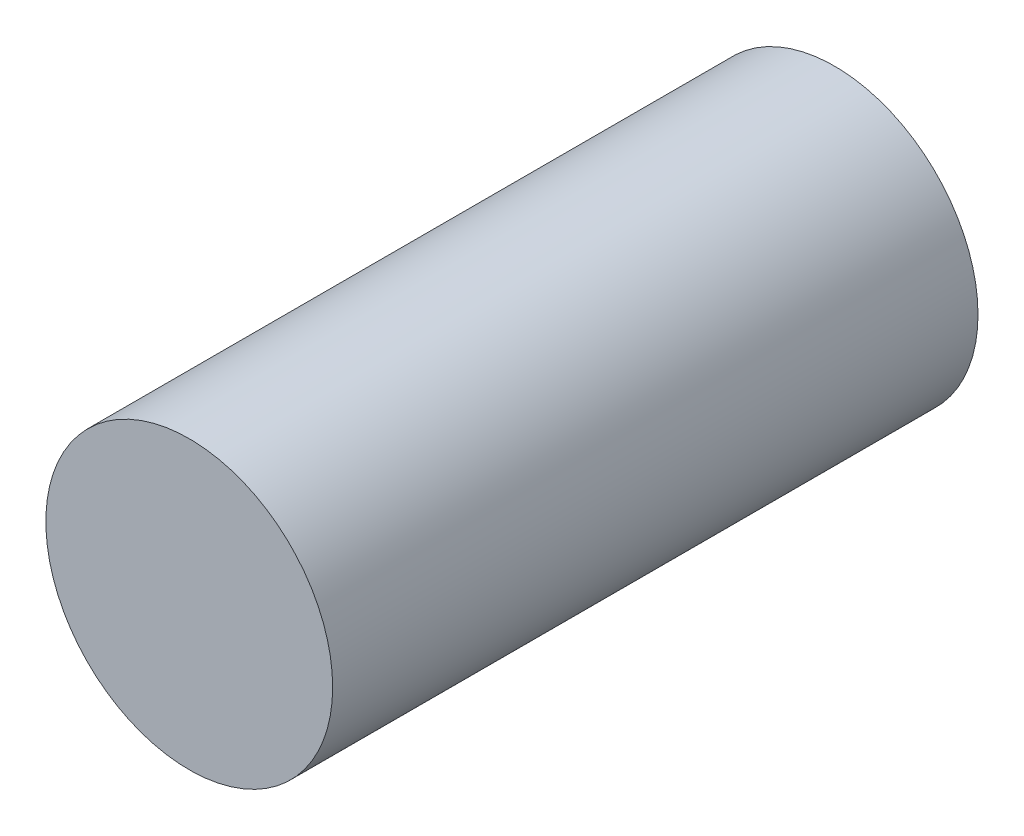
ISO-10303-21;
HEADER;
FILE_DESCRIPTION(('STEP AP214'),'2;1');
FILE_NAME('part.step','',(''),(''),'','','');
FILE_SCHEMA(('AUTOMOTIVE_DESIGN { 1 0 10303 214 1 1 1 1 }'));
ENDSEC;
DATA;
#1=APPLICATION_CONTEXT('core data for automotive mechanical design processes');
#2=APPLICATION_PROTOCOL_DEFINITION('international standard','automotive_design',2000,#1);
#3=PRODUCT_CONTEXT('',#1,'mechanical');
#4=PRODUCT('Part','Part','',(#3));
#5=PRODUCT_RELATED_PRODUCT_CATEGORY('part','',(#4));
#6=PRODUCT_DEFINITION_FORMATION('','',#4);
#7=PRODUCT_DEFINITION_CONTEXT('part definition',#1,'design');
#8=PRODUCT_DEFINITION('design','',#6,#7);
#9=PRODUCT_DEFINITION_SHAPE('','',#8);
#10=(LENGTH_UNIT() NAMED_UNIT(*) SI_UNIT(.MILLI.,.METRE.));
#11=(NAMED_UNIT(*) PLANE_ANGLE_UNIT() SI_UNIT($,.RADIAN.));
#12=(NAMED_UNIT(*) SI_UNIT($,.STERADIAN.) SOLID_ANGLE_UNIT());
#13=UNCERTAINTY_MEASURE_WITH_UNIT(LENGTH_MEASURE(1.E-05),#10,'distance_accuracy_value','');
#14=(GEOMETRIC_REPRESENTATION_CONTEXT(3) GLOBAL_UNCERTAINTY_ASSIGNED_CONTEXT((#13)) GLOBAL_UNIT_ASSIGNED_CONTEXT((#10,
#11,#12)) REPRESENTATION_CONTEXT('',''));
#15=CARTESIAN_POINT('',(0.,0.,0.));
#16=DIRECTION('',(0.,0.,1.));
#17=DIRECTION('',(1.,0.,0.));
#18=AXIS2_PLACEMENT_3D('',#15,#16,#17);
#19=CARTESIAN_POINT('',(21.5943396226415,0.,-90.));
#20=DIRECTION('',(0.,0.,-1.));
#21=DIRECTION('',(-0.999771447850948,0.0213787759710261,0.));
#22=AXIS2_PLACEMENT_3D('',#19,#20,#21);
#23=PLANE('',#22);
#24=CARTESIAN_POINT('',(21.5943396226415,0.,-90.));
#25=DIRECTION('',(0.,0.,-1.));
#26=DIRECTION('',(-1.,0.,0.));
#27=AXIS2_PLACEMENT_3D('',#24,#25,#26);
#28=CIRCLE('',#27,20.);
#29=CARTESIAN_POINT('',(1.59433962264151,0.,-90.));
#30=VERTEX_POINT('',#29);
#31=EDGE_CURVE('E10',#30,#30,#28,.F.);
#32=ORIENTED_EDGE('',*,*,#31,.F.);
#33=EDGE_LOOP('',(#32));
#34=FACE_BOUND('',#33,.T.);
#35=ADVANCED_FACE('F37',(#34),#23,.T.);
#36=CARTESIAN_POINT('',(21.5943396226415,0.,0.));
#37=DIRECTION('',(0.,0.,1.));
#38=DIRECTION('',(1.,0.,0.));
#39=AXIS2_PLACEMENT_3D('',#36,#37,#38);
#40=PLANE('',#39);
#41=CARTESIAN_POINT('',(21.5943396226415,0.,0.));
#42=DIRECTION('',(0.,0.,1.));
#43=DIRECTION('',(1.,0.,0.));
#44=AXIS2_PLACEMENT_3D('',#41,#42,#43);
#45=CIRCLE('',#44,20.);
#46=CARTESIAN_POINT('',(41.5943396226415,0.,0.));
#47=VERTEX_POINT('',#46);
#48=EDGE_CURVE('E43',#47,#47,#45,.T.);
#49=ORIENTED_EDGE('',*,*,#48,.T.);
#50=EDGE_LOOP('',(#49));
#51=FACE_BOUND('',#50,.T.);
#52=ADVANCED_FACE('F49',(#51),#40,.T.);
#53=CARTESIAN_POINT('',(21.5943396226415,0.,-146.568542494924));
#54=DIRECTION('',(0.,0.,1.));
#55=DIRECTION('',(1.,0.,0.));
#56=AXIS2_PLACEMENT_3D('',#53,#54,#55);
#57=CYLINDRICAL_SURFACE('',#56,20.);
#58=ORIENTED_EDGE('',*,*,#48,.F.);
#59=EDGE_LOOP('',(#58));
#60=FACE_BOUND('',#59,.T.);
#61=ORIENTED_EDGE('',*,*,#31,.T.);
#62=EDGE_LOOP('',(#61));
#63=FACE_BOUND('',#62,.T.);
#64=ADVANCED_FACE('F51',(#60,#63),#57,.T.);
#65=CLOSED_SHELL('',(#35,#52,#64));
#66=MANIFOLD_SOLID_BREP('B2',#65);
#67=ADVANCED_BREP_SHAPE_REPRESENTATION('',(#18,#66),#14);
#68=SHAPE_DEFINITION_REPRESENTATION(#9,#67);
ENDSEC;
END-ISO-10303-21;
